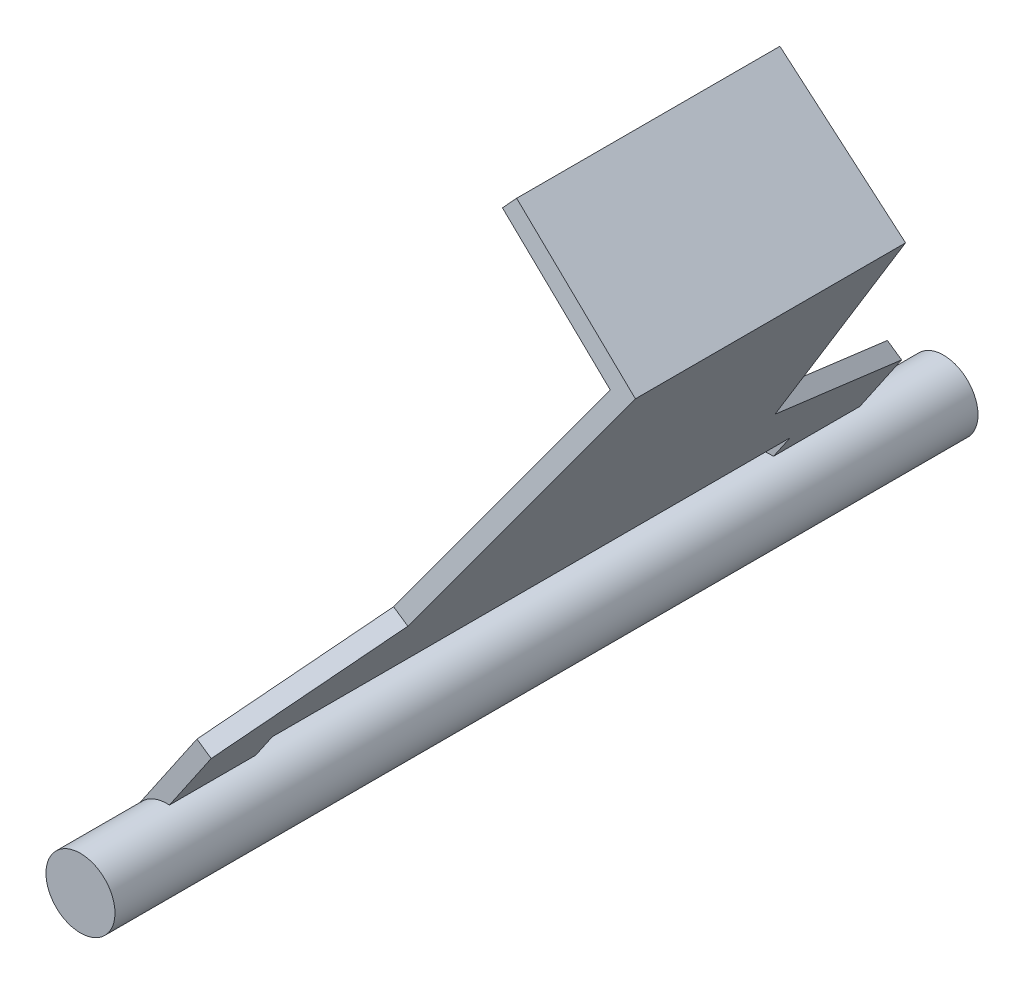
ISO-10303-21;
HEADER;
FILE_DESCRIPTION(('STEP AP214'),'2;1');
FILE_NAME('part.step','',(''),(''),'','','');
FILE_SCHEMA(('AUTOMOTIVE_DESIGN { 1 0 10303 214 1 1 1 1 }'));
ENDSEC;
DATA;
#1=APPLICATION_CONTEXT('core data for automotive mechanical design processes');
#2=APPLICATION_PROTOCOL_DEFINITION('international standard','automotive_design',2000,#1);
#3=PRODUCT_CONTEXT('',#1,'mechanical');
#4=PRODUCT('Part','Part','',(#3));
#5=PRODUCT_RELATED_PRODUCT_CATEGORY('part','',(#4));
#6=PRODUCT_DEFINITION_FORMATION('','',#4);
#7=PRODUCT_DEFINITION_CONTEXT('part definition',#1,'design');
#8=PRODUCT_DEFINITION('design','',#6,#7);
#9=PRODUCT_DEFINITION_SHAPE('','',#8);
#10=(LENGTH_UNIT() NAMED_UNIT(*) SI_UNIT(.MILLI.,.METRE.));
#11=(NAMED_UNIT(*) PLANE_ANGLE_UNIT() SI_UNIT($,.RADIAN.));
#12=(NAMED_UNIT(*) SI_UNIT($,.STERADIAN.) SOLID_ANGLE_UNIT());
#13=UNCERTAINTY_MEASURE_WITH_UNIT(LENGTH_MEASURE(1.E-05),#10,'distance_accuracy_value','');
#14=(GEOMETRIC_REPRESENTATION_CONTEXT(3) GLOBAL_UNCERTAINTY_ASSIGNED_CONTEXT((#13)) GLOBAL_UNIT_ASSIGNED_CONTEXT((#10,
#11,#12)) REPRESENTATION_CONTEXT('',''));
#15=CARTESIAN_POINT('',(0.,0.,0.));
#16=DIRECTION('',(0.,0.,1.));
#17=DIRECTION('',(1.,0.,0.));
#18=AXIS2_PLACEMENT_3D('',#15,#16,#17);
#19=CARTESIAN_POINT('',(-1.65162904796153,1.12788363226429,40.));
#20=DIRECTION('',(-0.825814523980765,0.563941816132145,0.));
#21=DIRECTION('',(-0.563941816132145,-0.825814523980765,0.));
#22=AXIS2_PLACEMENT_3D('',#19,#20,#21);
#23=PLANE('',#22);
#24=DIRECTION('',(0.563941816132145,0.825814523980765,0.));
#25=VECTOR('',#24,1.);
#26=CARTESIAN_POINT('',(-1.65162904796153,1.12788363226429,-30.));
#27=LINE('',#26,#25);
#28=CARTESIAN_POINT('',(0.301922708145551,3.98858905859028,-30.));
#29=VERTEX_POINT('',#28);
#30=CARTESIAN_POINT('',(2.23331576063067,6.81684613872142,-30.));
#31=VERTEX_POINT('',#30);
#32=EDGE_CURVE('E142',#29,#31,#27,.T.);
#33=ORIENTED_EDGE('',*,*,#32,.F.);
#34=DIRECTION('',(0.,0.,-1.));
#35=VECTOR('',#34,1.);
#36=CARTESIAN_POINT('',(0.301922708145551,3.98858905859027,40.));
#37=LINE('',#36,#35);
#38=CARTESIAN_POINT('',(0.301922708145551,3.98858905859028,-40.));
#39=VERTEX_POINT('',#38);
#40=EDGE_CURVE('E235',#29,#39,#37,.T.);
#41=ORIENTED_EDGE('',*,*,#40,.T.);
#42=DIRECTION('',(0.563941816132145,0.825814523980765,0.));
#43=VECTOR('',#42,1.);
#44=CARTESIAN_POINT('',(-1.65162904796153,1.12788363226429,-40.));
#45=LINE('',#44,#43);
#46=CARTESIAN_POINT('',(5.14915459857713,11.0866874469587,-40.));
#47=VERTEX_POINT('',#46);
#48=EDGE_CURVE('E215',#39,#47,#45,.T.);
#49=ORIENTED_EDGE('',*,*,#48,.T.);
#50=DIRECTION('',(-0.202181195497719,-0.296066301419094,-0.933524241437324));
#51=VECTOR('',#50,1.);
#52=CARTESIAN_POINT('',(9.2059057202515,17.0272364550658,-21.2689033505898));
#53=LINE('',#52,#51);
#54=CARTESIAN_POINT('',(9.2059057202515,17.0272364550658,-21.2689033505898));
#55=VERTEX_POINT('',#54);
#56=EDGE_CURVE('E169',#55,#47,#53,.T.);
#57=ORIENTED_EDGE('',*,*,#56,.F.);
#58=DIRECTION('',(-0.557482158372764,-0.816355251685214,-0.15092298082802));
#59=VECTOR('',#58,1.);
#60=CARTESIAN_POINT('',(33.5666738090889,52.7002004517187,-14.6738945597092));
#61=LINE('',#60,#59);
#62=CARTESIAN_POINT('',(29.9538476820553,47.4097179888569,-15.6519679924031));
#63=VERTEX_POINT('',#62);
#64=EDGE_CURVE('E151',#63,#55,#61,.T.);
#65=ORIENTED_EDGE('',*,*,#64,.F.);
#66=DIRECTION('',(0.,0.,-1.));
#67=VECTOR('',#66,1.);
#68=CARTESIAN_POINT('',(29.9538476820553,47.4097179888569,40.));
#69=LINE('',#68,#67);
#70=CARTESIAN_POINT('',(29.9538476820553,47.4097179888569,15.6519679924031));
#71=VERTEX_POINT('',#70);
#72=EDGE_CURVE('E228',#71,#63,#69,.T.);
#73=ORIENTED_EDGE('',*,*,#72,.F.);
#74=DIRECTION('',(0.557482158372764,0.816355251685214,-0.15092298082802));
#75=VECTOR('',#74,1.);
#76=CARTESIAN_POINT('',(33.5666738090889,52.7002004517187,14.6738945597092));
#77=LINE('',#76,#75);
#78=CARTESIAN_POINT('',(9.2059057202515,17.0272364550658,21.2689033505898));
#79=VERTEX_POINT('',#78);
#80=EDGE_CURVE('E175',#79,#71,#77,.T.);
#81=ORIENTED_EDGE('',*,*,#80,.F.);
#82=DIRECTION('',(0.202181195497719,0.296066301419094,-0.933524241437324));
#83=VECTOR('',#82,1.);
#84=CARTESIAN_POINT('',(9.2059057202515,17.0272364550658,21.2689033505898));
#85=LINE('',#84,#83);
#86=CARTESIAN_POINT('',(5.14915459857713,11.0866874469587,40.));
#87=VERTEX_POINT('',#86);
#88=EDGE_CURVE('E168',#87,#79,#85,.T.);
#89=ORIENTED_EDGE('',*,*,#88,.F.);
#90=DIRECTION('',(0.563941816132145,0.825814523980765,0.));
#91=VECTOR('',#90,1.);
#92=CARTESIAN_POINT('',(-1.65162904796153,1.12788363226429,40.));
#93=LINE('',#92,#91);
#94=CARTESIAN_POINT('',(0.301922708145551,3.98858905859028,40.));
#95=VERTEX_POINT('',#94);
#96=EDGE_CURVE('E205',#95,#87,#93,.T.);
#97=ORIENTED_EDGE('',*,*,#96,.F.);
#98=CARTESIAN_POINT('',(0.301922708145551,3.98858905859028,30.));
#99=VERTEX_POINT('',#98);
#100=EDGE_CURVE('E232',#95,#99,#37,.T.);
#101=ORIENTED_EDGE('',*,*,#100,.T.);
#102=DIRECTION('',(0.563941816132145,0.825814523980765,0.));
#103=VECTOR('',#102,1.);
#104=CARTESIAN_POINT('',(-1.65162904796153,1.12788363226429,30.));
#105=LINE('',#104,#103);
#106=CARTESIAN_POINT('',(2.23331576063067,6.81684613872142,30.));
#107=VERTEX_POINT('',#106);
#108=EDGE_CURVE('E155',#99,#107,#105,.T.);
#109=ORIENTED_EDGE('',*,*,#108,.T.);
#110=DIRECTION('',(0.,0.,1.));
#111=VECTOR('',#110,1.);
#112=CARTESIAN_POINT('',(2.23331576063067,6.81684613872142,-30.));
#113=LINE('',#112,#111);
#114=EDGE_CURVE('E156',#31,#107,#113,.T.);
#115=ORIENTED_EDGE('',*,*,#114,.F.);
#116=EDGE_LOOP('',(#33,#41,#49,#57,#65,#73,#81,#89,#97,#101,#109,#115));
#117=FACE_BOUND('',#116,.T.);
#118=ADVANCED_FACE('F45',(#117),#23,.F.);
#119=CARTESIAN_POINT('',(-3.30325809592306,2.25576726452858,40.));
#120=DIRECTION('',(-0.825814523980765,0.563941816132145,0.));
#121=DIRECTION('',(-0.563941816132145,-0.825814523980765,0.));
#122=AXIS2_PLACEMENT_3D('',#119,#120,#121);
#123=PLANE('',#122);
#124=DIRECTION('',(0.,0.,-1.));
#125=VECTOR('',#124,1.);
#126=CARTESIAN_POINT('',(-3.30325809592306,2.25576726452858,40.));
#127=LINE('',#126,#125);
#128=CARTESIAN_POINT('',(-3.30325809592306,2.25576726452858,-30.));
#129=VERTEX_POINT('',#128);
#130=CARTESIAN_POINT('',(-3.30325809592306,2.25576726452858,-40.));
#131=VERTEX_POINT('',#130);
#132=EDGE_CURVE('E207',#129,#131,#127,.T.);
#133=ORIENTED_EDGE('',*,*,#132,.F.);
#134=DIRECTION('',(0.563941816132145,0.825814523980765,0.));
#135=VECTOR('',#134,1.);
#136=CARTESIAN_POINT('',(-3.30325809592306,2.25576726452858,-30.));
#137=LINE('',#136,#135);
#138=CARTESIAN_POINT('',(0.58168671266914,7.94472977098571,-30.));
#139=VERTEX_POINT('',#138);
#140=EDGE_CURVE('E12',#129,#139,#137,.T.);
#141=ORIENTED_EDGE('',*,*,#140,.T.);
#142=DIRECTION('',(0.,0.,-1.));
#143=VECTOR('',#142,1.);
#144=CARTESIAN_POINT('',(0.581686712669141,7.94472977098571,40.));
#145=LINE('',#144,#143);
#146=CARTESIAN_POINT('',(0.58168671266914,7.94472977098571,30.));
#147=VERTEX_POINT('',#146);
#148=EDGE_CURVE('E49',#147,#139,#145,.T.);
#149=ORIENTED_EDGE('',*,*,#148,.F.);
#150=DIRECTION('',(0.563941816132145,0.825814523980765,0.));
#151=VECTOR('',#150,1.);
#152=CARTESIAN_POINT('',(-3.30325809592306,2.25576726452858,30.));
#153=LINE('',#152,#151);
#154=CARTESIAN_POINT('',(-3.30325809592306,2.25576726452858,30.));
#155=VERTEX_POINT('',#154);
#156=EDGE_CURVE('E249',#155,#147,#153,.T.);
#157=ORIENTED_EDGE('',*,*,#156,.F.);
#158=CARTESIAN_POINT('',(-3.30325809592306,2.25576726452858,40.));
#159=VERTEX_POINT('',#158);
#160=EDGE_CURVE('E220',#159,#155,#127,.T.);
#161=ORIENTED_EDGE('',*,*,#160,.F.);
#162=DIRECTION('',(0.563941816132145,0.825814523980765,0.));
#163=VECTOR('',#162,1.);
#164=CARTESIAN_POINT('',(-3.30325809592306,2.25576726452858,40.));
#165=LINE('',#164,#163);
#166=CARTESIAN_POINT('',(3.4975255506156,12.214571079223,40.));
#167=VERTEX_POINT('',#166);
#168=EDGE_CURVE('E206',#159,#167,#165,.T.);
#169=ORIENTED_EDGE('',*,*,#168,.T.);
#170=DIRECTION('',(-0.202181195497719,-0.296066301419094,0.933524241437324));
#171=VECTOR('',#170,1.);
#172=CARTESIAN_POINT('',(2.62340389016189,10.9345412210369,44.0360517108931));
#173=LINE('',#172,#171);
#174=CARTESIAN_POINT('',(7.55427667228997,18.1551200873301,21.2689033505898));
#175=VERTEX_POINT('',#174);
#176=EDGE_CURVE('E182',#175,#167,#173,.T.);
#177=ORIENTED_EDGE('',*,*,#176,.F.);
#178=DIRECTION('',(-0.557482158372764,-0.816355251685214,0.15092298082802));
#179=VECTOR('',#178,1.);
#180=CARTESIAN_POINT('',(-4.63192375213653,0.310120807699056,24.5679823711463));
#181=LINE('',#180,#179);
#182=CARTESIAN_POINT('',(27.3198031283432,47.0989904558825,15.9179300044832));
#183=VERTEX_POINT('',#182);
#184=EDGE_CURVE('E247',#183,#175,#181,.T.);
#185=ORIENTED_EDGE('',*,*,#184,.F.);
#186=DIRECTION('',(0.,0.,-1.));
#187=VECTOR('',#186,1.);
#188=CARTESIAN_POINT('',(27.3198031283432,47.0989904558825,40.));
#189=LINE('',#188,#187);
#190=CARTESIAN_POINT('',(27.3198031283432,47.0989904558825,-15.9179300044832));
#191=VERTEX_POINT('',#190);
#192=EDGE_CURVE('E219',#183,#191,#189,.T.);
#193=ORIENTED_EDGE('',*,*,#192,.T.);
#194=DIRECTION('',(0.557482158372764,0.816355251685214,0.15092298082802));
#195=VECTOR('',#194,1.);
#196=CARTESIAN_POINT('',(2.09902577586795,10.1666622476143,-22.7457626797851));
#197=LINE('',#196,#195);
#198=CARTESIAN_POINT('',(7.55427667228995,18.1551200873301,-21.2689033505898));
#199=VERTEX_POINT('',#198);
#200=EDGE_CURVE('E246',#199,#191,#197,.T.);
#201=ORIENTED_EDGE('',*,*,#200,.F.);
#202=DIRECTION('',(0.202181195497719,0.296066301419094,0.933524241437324));
#203=VECTOR('',#202,1.);
#204=CARTESIAN_POINT('',(17.7226876629538,33.04534677683,25.6813490371974));
#205=LINE('',#204,#203);
#206=CARTESIAN_POINT('',(3.4975255506156,12.214571079223,-40.));
#207=VERTEX_POINT('',#206);
#208=EDGE_CURVE('E177',#207,#199,#205,.T.);
#209=ORIENTED_EDGE('',*,*,#208,.F.);
#210=DIRECTION('',(0.563941816132145,0.825814523980765,0.));
#211=VECTOR('',#210,1.);
#212=CARTESIAN_POINT('',(-3.30325809592306,2.25576726452858,-40.));
#213=LINE('',#212,#211);
#214=EDGE_CURVE('E201',#131,#207,#213,.T.);
#215=ORIENTED_EDGE('',*,*,#214,.F.);
#216=EDGE_LOOP('',(#133,#141,#149,#157,#161,#169,#177,#185,#193,#201,#209,#215));
#217=FACE_BOUND('',#216,.T.);
#218=ADVANCED_FACE('F254',(#217),#123,.T.);
#219=CARTESIAN_POINT('',(0.,0.,50.));
#220=DIRECTION('',(0.,0.,-1.));
#221=DIRECTION('',(-1.,0.,0.));
#222=AXIS2_PLACEMENT_3D('',#219,#220,#221);
#223=CYLINDRICAL_SURFACE('',#222,4.);
#224=ORIENTED_EDGE('',*,*,#160,.T.);
#225=CARTESIAN_POINT('',(0.,0.,30.));
#226=DIRECTION('',(0.,0.,1.));
#227=DIRECTION('',(1.,0.,0.));
#228=AXIS2_PLACEMENT_3D('',#225,#226,#227);
#229=CIRCLE('',#228,4.);
#230=EDGE_CURVE('E61',#99,#155,#229,.T.);
#231=ORIENTED_EDGE('',*,*,#230,.F.);
#232=ORIENTED_EDGE('',*,*,#100,.F.);
#233=CARTESIAN_POINT('',(0.,0.,40.));
#234=DIRECTION('',(0.,0.,1.));
#235=DIRECTION('',(1.,0.,0.));
#236=AXIS2_PLACEMENT_3D('',#233,#234,#235);
#237=CIRCLE('',#236,4.);
#238=EDGE_CURVE('E199',#95,#159,#237,.T.);
#239=ORIENTED_EDGE('',*,*,#238,.T.);
#240=EDGE_LOOP('',(#224,#231,#232,#239));
#241=FACE_BOUND('',#240,.T.);
#242=CARTESIAN_POINT('',(0.,0.,50.));
#243=DIRECTION('',(0.,0.,1.));
#244=DIRECTION('',(1.,0.,0.));
#245=AXIS2_PLACEMENT_3D('',#242,#243,#244);
#246=CIRCLE('',#245,4.);
#247=CARTESIAN_POINT('',(4.,0.,50.));
#248=VERTEX_POINT('',#247);
#249=EDGE_CURVE('E237',#248,#248,#246,.T.);
#250=ORIENTED_EDGE('',*,*,#249,.F.);
#251=EDGE_LOOP('',(#250));
#252=FACE_BOUND('',#251,.T.);
#253=CARTESIAN_POINT('',(0.,0.,-30.));
#254=DIRECTION('',(0.,0.,1.));
#255=DIRECTION('',(1.,0.,0.));
#256=AXIS2_PLACEMENT_3D('',#253,#254,#255);
#257=CIRCLE('',#256,4.);
#258=EDGE_CURVE('E150',#29,#129,#257,.T.);
#259=ORIENTED_EDGE('',*,*,#258,.T.);
#260=ORIENTED_EDGE('',*,*,#132,.T.);
#261=CARTESIAN_POINT('',(0.,0.,-40.));
#262=DIRECTION('',(0.,0.,1.));
#263=DIRECTION('',(1.,0.,0.));
#264=AXIS2_PLACEMENT_3D('',#261,#262,#263);
#265=CIRCLE('',#264,4.);
#266=EDGE_CURVE('E200',#39,#131,#265,.T.);
#267=ORIENTED_EDGE('',*,*,#266,.F.);
#268=ORIENTED_EDGE('',*,*,#40,.F.);
#269=EDGE_LOOP('',(#259,#260,#267,#268));
#270=FACE_BOUND('',#269,.T.);
#271=CARTESIAN_POINT('',(0.,0.,-50.));
#272=DIRECTION('',(0.,0.,1.));
#273=DIRECTION('',(1.,0.,0.));
#274=AXIS2_PLACEMENT_3D('',#271,#272,#273);
#275=CIRCLE('',#274,4.);
#276=CARTESIAN_POINT('',(4.,0.,-50.));
#277=VERTEX_POINT('',#276);
#278=EDGE_CURVE('E234',#277,#277,#275,.T.);
#279=ORIENTED_EDGE('',*,*,#278,.T.);
#280=EDGE_LOOP('',(#279));
#281=FACE_BOUND('',#280,.T.);
#282=ADVANCED_FACE('F42',(#241,#252,#270,#281),#223,.T.);
#283=CARTESIAN_POINT('',(0.,0.,50.));
#284=DIRECTION('',(0.,0.,1.));
#285=DIRECTION('',(1.,0.,0.));
#286=AXIS2_PLACEMENT_3D('',#283,#284,#285);
#287=PLANE('',#286);
#288=ORIENTED_EDGE('',*,*,#249,.T.);
#289=EDGE_LOOP('',(#288));
#290=FACE_BOUND('',#289,.T.);
#291=ADVANCED_FACE('F302',(#290),#287,.T.);
#292=CARTESIAN_POINT('',(0.,0.,-50.));
#293=DIRECTION('',(0.,0.,1.));
#294=DIRECTION('',(1.,0.,0.));
#295=AXIS2_PLACEMENT_3D('',#292,#293,#294);
#296=PLANE('',#295);
#297=ORIENTED_EDGE('',*,*,#278,.F.);
#298=EDGE_LOOP('',(#297));
#299=FACE_BOUND('',#298,.T.);
#300=ADVANCED_FACE('F307',(#299),#296,.F.);
#301=CARTESIAN_POINT('',(37.1164369712877,40.9115596090355,40.));
#302=DIRECTION('',(-0.671920254283912,-0.74062350211362,0.));
#303=DIRECTION('',(0.74062350211362,-0.671920254283912,0.));
#304=AXIS2_PLACEMENT_3D('',#301,#302,#303);
#305=PLANE('',#304);
#306=DIRECTION('',(0.,0.,-1.));
#307=VECTOR('',#306,1.);
#308=CARTESIAN_POINT('',(15.7936550696375,60.2563535515849,40.));
#309=LINE('',#308,#307);
#310=CARTESIAN_POINT('',(15.7936550696375,60.2563535515849,15.2514468483787));
#311=VERTEX_POINT('',#310);
#312=CARTESIAN_POINT('',(15.7936550696375,60.2563535515849,-15.2514468483787));
#313=VERTEX_POINT('',#312);
#314=EDGE_CURVE('E229',#311,#313,#309,.T.);
#315=ORIENTED_EDGE('',*,*,#314,.F.);
#316=DIRECTION('',(0.74046104746781,-0.671772869591675,0.0209439457467055));
#317=VECTOR('',#316,1.);
#318=CARTESIAN_POINT('',(37.4908886754033,40.5718435677158,15.8651532479884));
#319=LINE('',#318,#317);
#320=EDGE_CURVE('E198',#311,#71,#319,.T.);
#321=ORIENTED_EDGE('',*,*,#320,.T.);
#322=ORIENTED_EDGE('',*,*,#72,.T.);
#323=DIRECTION('',(-0.74046104746781,0.671772869591675,0.0209439457467055));
#324=VECTOR('',#323,1.);
#325=CARTESIAN_POINT('',(36.2502345949461,41.6974095305028,-15.8300613389132));
#326=LINE('',#325,#324);
#327=EDGE_CURVE('E190',#63,#313,#326,.T.);
#328=ORIENTED_EDGE('',*,*,#327,.T.);
#329=EDGE_LOOP('',(#315,#321,#322,#328));
#330=FACE_BOUND('',#329,.T.);
#331=ADVANCED_FACE('F283',(#330),#305,.F.);
#332=CARTESIAN_POINT('',(-21.3227819016502,19.3447939425493,40.));
#333=DIRECTION('',(0.740623502113621,-0.671920254283911,0.));
#334=DIRECTION('',(0.671920254283911,0.740623502113621,0.));
#335=AXIS2_PLACEMENT_3D('',#332,#333,#334);
#336=PLANE('',#335);
#337=DIRECTION('',(0.,0.,-1.));
#338=VECTOR('',#337,1.);
#339=CARTESIAN_POINT('',(14.4498145610696,58.7751065473576,40.));
#340=LINE('',#339,#338);
#341=CARTESIAN_POINT('',(14.4498145610696,58.7751065473576,15.553902290621));
#342=VERTEX_POINT('',#341);
#343=CARTESIAN_POINT('',(14.4498145610696,58.7751065473576,-15.553902290621));
#344=VERTEX_POINT('',#343);
#345=EDGE_CURVE('E224',#342,#344,#340,.T.);
#346=ORIENTED_EDGE('',*,*,#345,.F.);
#347=DIRECTION('',(0.664366230666714,0.732297086306466,-0.149527552433532));
#348=VECTOR('',#347,1.);
#349=CARTESIAN_POINT('',(-22.9514618704886,17.5495828968145,23.9717312899796));
#350=LINE('',#349,#348);
#351=EDGE_CURVE('E192',#342,#311,#350,.T.);
#352=ORIENTED_EDGE('',*,*,#351,.T.);
#353=ORIENTED_EDGE('',*,*,#314,.T.);
#354=DIRECTION('',(-0.664366230666714,-0.732297086306466,-0.149527552433532));
#355=VECTOR('',#354,1.);
#356=CARTESIAN_POINT('',(-15.0041773592018,26.3094701743835,-22.1830521750386));
#357=LINE('',#356,#355);
#358=EDGE_CURVE('E183',#313,#344,#357,.T.);
#359=ORIENTED_EDGE('',*,*,#358,.T.);
#360=EDGE_LOOP('',(#346,#352,#353,#359));
#361=FACE_BOUND('',#360,.T.);
#362=ADVANCED_FACE('F284',(#361),#336,.F.);
#363=CARTESIAN_POINT('',(35.7725964627199,39.4303126048083,40.));
#364=DIRECTION('',(-0.671920254283912,-0.74062350211362,0.));
#365=DIRECTION('',(0.74062350211362,-0.671920254283912,0.));
#366=AXIS2_PLACEMENT_3D('',#363,#364,#365);
#367=PLANE('',#366);
#368=DIRECTION('',(0.74046104746781,-0.671772869591675,0.0209439457467055));
#369=VECTOR('',#368,1.);
#370=CARTESIAN_POINT('',(36.1423576346033,39.0948519828767,16.1674760184948));
#371=LINE('',#370,#369);
#372=EDGE_CURVE('E191',#342,#183,#371,.T.);
#373=ORIENTED_EDGE('',*,*,#372,.F.);
#374=ORIENTED_EDGE('',*,*,#345,.T.);
#375=DIRECTION('',(-0.74046104746781,0.671772869591675,0.0209439457467055));
#376=VECTOR('',#375,1.);
#377=CARTESIAN_POINT('',(34.9017035541461,40.2204179456636,-16.1323841094195));
#378=LINE('',#377,#376);
#379=EDGE_CURVE('E181',#191,#344,#378,.T.);
#380=ORIENTED_EDGE('',*,*,#379,.F.);
#381=ORIENTED_EDGE('',*,*,#192,.F.);
#382=EDGE_LOOP('',(#373,#374,#380,#381));
#383=FACE_BOUND('',#382,.T.);
#384=ADVANCED_FACE('F279',(#383),#367,.T.);
#385=CARTESIAN_POINT('',(0.,0.,40.));
#386=DIRECTION('',(0.,0.,1.));
#387=DIRECTION('',(1.,0.,0.));
#388=AXIS2_PLACEMENT_3D('',#385,#386,#387);
#389=PLANE('',#388);
#390=DIRECTION('',(0.825814523980765,-0.563941816132145,0.));
#391=VECTOR('',#390,1.);
#392=CARTESIAN_POINT('',(6.80078364653866,9.95880381469441,40.));
#393=LINE('',#392,#391);
#394=EDGE_CURVE('E243',#167,#87,#393,.T.);
#395=ORIENTED_EDGE('',*,*,#394,.F.);
#396=ORIENTED_EDGE('',*,*,#168,.F.);
#397=ORIENTED_EDGE('',*,*,#238,.F.);
#398=ORIENTED_EDGE('',*,*,#96,.T.);
#399=EDGE_LOOP('',(#395,#396,#397,#398));
#400=FACE_BOUND('',#399,.T.);
#401=ADVANCED_FACE('F300',(#400),#389,.T.);
#402=CARTESIAN_POINT('',(0.,0.,-40.));
#403=DIRECTION('',(0.,0.,1.));
#404=DIRECTION('',(1.,0.,0.));
#405=AXIS2_PLACEMENT_3D('',#402,#403,#404);
#406=PLANE('',#405);
#407=ORIENTED_EDGE('',*,*,#214,.T.);
#408=DIRECTION('',(0.825814523980765,-0.563941816132145,0.));
#409=VECTOR('',#408,1.);
#410=CARTESIAN_POINT('',(6.80078364653866,9.95880381469441,-40.));
#411=LINE('',#410,#409);
#412=EDGE_CURVE('E239',#207,#47,#411,.T.);
#413=ORIENTED_EDGE('',*,*,#412,.T.);
#414=ORIENTED_EDGE('',*,*,#48,.F.);
#415=ORIENTED_EDGE('',*,*,#266,.T.);
#416=EDGE_LOOP('',(#407,#413,#414,#415));
#417=FACE_BOUND('',#416,.T.);
#418=ADVANCED_FACE('F264',(#417),#406,.F.);
#419=CARTESIAN_POINT('',(-56.8592561982097,62.1425817456374,-21.2689033505898));
#420=DIRECTION('',(-0.526453356119548,-0.770917877067069,0.358514282349907));
#421=DIRECTION('',(0.825814523980765,-0.563941816132145,0.));
#422=AXIS2_PLACEMENT_3D('',#419,#420,#421);
#423=PLANE('',#422);
#424=ORIENTED_EDGE('',*,*,#208,.T.);
#425=DIRECTION('',(0.825814523980765,-0.563941816132145,0.));
#426=VECTOR('',#425,1.);
#427=CARTESIAN_POINT('',(-56.8592561982097,62.1425817456374,-21.2689033505898));
#428=LINE('',#427,#426);
#429=EDGE_CURVE('E172',#199,#55,#428,.T.);
#430=ORIENTED_EDGE('',*,*,#429,.T.);
#431=ORIENTED_EDGE('',*,*,#56,.T.);
#432=ORIENTED_EDGE('',*,*,#412,.F.);
#433=EDGE_LOOP('',(#424,#430,#431,#432));
#434=FACE_BOUND('',#433,.T.);
#435=ADVANCED_FACE('F268',(#434),#423,.F.);
#436=CARTESIAN_POINT('',(-32.4984881093723,97.8155457422903,-14.6738945597092));
#437=DIRECTION('',(-0.0851117799042305,-0.12463438957025,0.988545524423628));
#438=DIRECTION('',(0.,-0.992145614948804,-0.125088283775339));
#439=AXIS2_PLACEMENT_3D('',#436,#437,#438);
#440=PLANE('',#439);
#441=ORIENTED_EDGE('',*,*,#64,.T.);
#442=ORIENTED_EDGE('',*,*,#429,.F.);
#443=ORIENTED_EDGE('',*,*,#200,.T.);
#444=ORIENTED_EDGE('',*,*,#379,.T.);
#445=ORIENTED_EDGE('',*,*,#358,.F.);
#446=ORIENTED_EDGE('',*,*,#327,.F.);
#447=EDGE_LOOP('',(#441,#442,#443,#444,#445,#446));
#448=FACE_BOUND('',#447,.T.);
#449=ADVANCED_FACE('F274',(#448),#440,.F.);
#450=CARTESIAN_POINT('',(-32.4984881093723,97.8155457422903,14.6738945597092));
#451=DIRECTION('',(-0.0851117799042305,-0.12463438957025,-0.988545524423628));
#452=DIRECTION('',(0.,0.992145614948804,-0.125088283775339));
#453=AXIS2_PLACEMENT_3D('',#450,#451,#452);
#454=PLANE('',#453);
#455=ORIENTED_EDGE('',*,*,#351,.F.);
#456=ORIENTED_EDGE('',*,*,#372,.T.);
#457=ORIENTED_EDGE('',*,*,#184,.T.);
#458=DIRECTION('',(0.825814523980765,-0.563941816132145,0.));
#459=VECTOR('',#458,1.);
#460=CARTESIAN_POINT('',(-56.8592561982097,62.1425817456374,21.2689033505898));
#461=LINE('',#460,#459);
#462=EDGE_CURVE('E176',#175,#79,#461,.T.);
#463=ORIENTED_EDGE('',*,*,#462,.T.);
#464=ORIENTED_EDGE('',*,*,#80,.T.);
#465=ORIENTED_EDGE('',*,*,#320,.F.);
#466=EDGE_LOOP('',(#455,#456,#457,#463,#464,#465));
#467=FACE_BOUND('',#466,.T.);
#468=ADVANCED_FACE('F289',(#467),#454,.F.);
#469=CARTESIAN_POINT('',(-56.8592561982097,62.1425817456374,21.2689033505898));
#470=DIRECTION('',(-0.526453356119548,-0.770917877067069,-0.358514282349907));
#471=DIRECTION('',(0.825814523980765,-0.563941816132145,0.));
#472=AXIS2_PLACEMENT_3D('',#469,#470,#471);
#473=PLANE('',#472);
#474=ORIENTED_EDGE('',*,*,#176,.T.);
#475=ORIENTED_EDGE('',*,*,#394,.T.);
#476=ORIENTED_EDGE('',*,*,#88,.T.);
#477=ORIENTED_EDGE('',*,*,#462,.F.);
#478=EDGE_LOOP('',(#474,#475,#476,#477));
#479=FACE_BOUND('',#478,.T.);
#480=ADVANCED_FACE('F294',(#479),#473,.F.);
#481=CARTESIAN_POINT('',(0.,0.,-30.));
#482=DIRECTION('',(0.,0.,1.));
#483=DIRECTION('',(1.,0.,0.));
#484=AXIS2_PLACEMENT_3D('',#481,#482,#483);
#485=PLANE('',#484);
#486=ORIENTED_EDGE('',*,*,#32,.T.);
#487=DIRECTION('',(-0.825814523980765,0.563941816132145,0.));
#488=VECTOR('',#487,1.);
#489=CARTESIAN_POINT('',(3.8849448085922,5.68896250645713,-30.));
#490=LINE('',#489,#488);
#491=EDGE_CURVE('E144',#31,#139,#490,.T.);
#492=ORIENTED_EDGE('',*,*,#491,.T.);
#493=ORIENTED_EDGE('',*,*,#140,.F.);
#494=ORIENTED_EDGE('',*,*,#258,.F.);
#495=EDGE_LOOP('',(#486,#492,#493,#494));
#496=FACE_BOUND('',#495,.T.);
#497=ADVANCED_FACE('F145',(#496),#485,.T.);
#498=CARTESIAN_POINT('',(0.,0.,30.));
#499=DIRECTION('',(0.,0.,1.));
#500=DIRECTION('',(1.,0.,0.));
#501=AXIS2_PLACEMENT_3D('',#498,#499,#500);
#502=PLANE('',#501);
#503=ORIENTED_EDGE('',*,*,#230,.T.);
#504=ORIENTED_EDGE('',*,*,#156,.T.);
#505=DIRECTION('',(-0.825814523980765,0.563941816132145,0.));
#506=VECTOR('',#505,1.);
#507=CARTESIAN_POINT('',(3.8849448085922,5.68896250645713,30.));
#508=LINE('',#507,#506);
#509=EDGE_CURVE('E60',#107,#147,#508,.T.);
#510=ORIENTED_EDGE('',*,*,#509,.F.);
#511=ORIENTED_EDGE('',*,*,#108,.F.);
#512=EDGE_LOOP('',(#503,#504,#510,#511));
#513=FACE_BOUND('',#512,.T.);
#514=ADVANCED_FACE('F253',(#513),#502,.F.);
#515=CARTESIAN_POINT('',(3.8849448085922,5.68896250645713,-30.));
#516=DIRECTION('',(0.563941816132145,0.825814523980765,0.));
#517=DIRECTION('',(-0.825814523980765,0.563941816132145,0.));
#518=AXIS2_PLACEMENT_3D('',#515,#516,#517);
#519=PLANE('',#518);
#520=ORIENTED_EDGE('',*,*,#148,.T.);
#521=ORIENTED_EDGE('',*,*,#491,.F.);
#522=ORIENTED_EDGE('',*,*,#114,.T.);
#523=ORIENTED_EDGE('',*,*,#509,.T.);
#524=EDGE_LOOP('',(#520,#521,#522,#523));
#525=FACE_BOUND('',#524,.T.);
#526=ADVANCED_FACE('F154',(#525),#519,.F.);
#527=CLOSED_SHELL('',(#118,#218,#282,#291,#300,#331,#362,#384,#401,#418,#435,#449,#468,#480,
#497,#514,#526));
#528=MANIFOLD_SOLID_BREP('B2',#527);
#529=ADVANCED_BREP_SHAPE_REPRESENTATION('',(#18,#528),#14);
#530=SHAPE_DEFINITION_REPRESENTATION(#9,#529);
ENDSEC;
END-ISO-10303-21;
